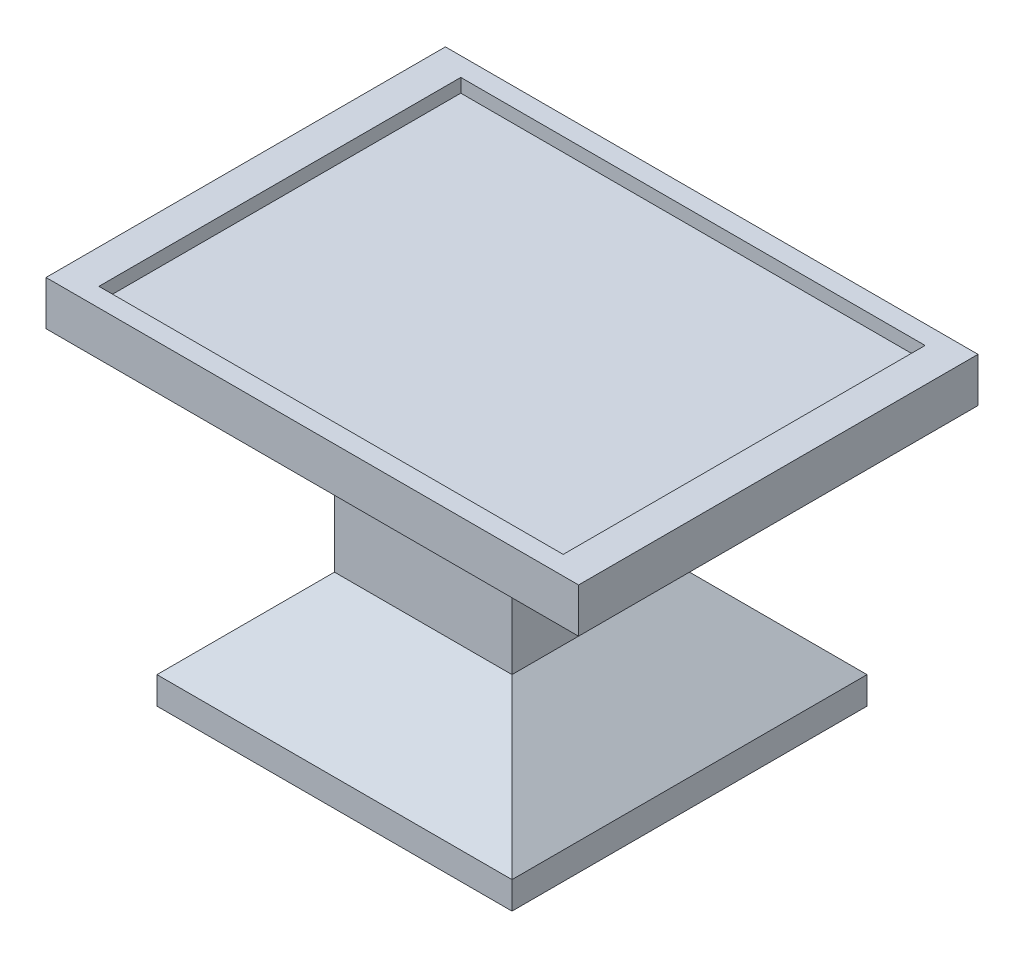
ISO-10303-21;
HEADER;
FILE_DESCRIPTION(('STEP AP214'),'2;1');
FILE_NAME('part.step','',(''),(''),'','','');
FILE_SCHEMA(('AUTOMOTIVE_DESIGN { 1 0 10303 214 1 1 1 1 }'));
ENDSEC;
DATA;
#1=APPLICATION_CONTEXT('core data for automotive mechanical design processes');
#2=APPLICATION_PROTOCOL_DEFINITION('international standard','automotive_design',2000,#1);
#3=PRODUCT_CONTEXT('',#1,'mechanical');
#4=PRODUCT('Part','Part','',(#3));
#5=PRODUCT_RELATED_PRODUCT_CATEGORY('part','',(#4));
#6=PRODUCT_DEFINITION_FORMATION('','',#4);
#7=PRODUCT_DEFINITION_CONTEXT('part definition',#1,'design');
#8=PRODUCT_DEFINITION('design','',#6,#7);
#9=PRODUCT_DEFINITION_SHAPE('','',#8);
#10=(LENGTH_UNIT() NAMED_UNIT(*) SI_UNIT(.MILLI.,.METRE.));
#11=(NAMED_UNIT(*) PLANE_ANGLE_UNIT() SI_UNIT($,.RADIAN.));
#12=(NAMED_UNIT(*) SI_UNIT($,.STERADIAN.) SOLID_ANGLE_UNIT());
#13=UNCERTAINTY_MEASURE_WITH_UNIT(LENGTH_MEASURE(1.E-05),#10,'distance_accuracy_value','');
#14=(GEOMETRIC_REPRESENTATION_CONTEXT(3) GLOBAL_UNCERTAINTY_ASSIGNED_CONTEXT((#13)) GLOBAL_UNIT_ASSIGNED_CONTEXT((#10,
#11,#12)) REPRESENTATION_CONTEXT('',''));
#15=CARTESIAN_POINT('',(0.,0.,0.));
#16=DIRECTION('',(0.,0.,1.));
#17=DIRECTION('',(1.,0.,0.));
#18=AXIS2_PLACEMENT_3D('',#15,#16,#17);
#19=CARTESIAN_POINT('',(0.,3.25,0.));
#20=DIRECTION('',(0.,1.,0.));
#21=DIRECTION('',(0.,0.,1.));
#22=AXIS2_PLACEMENT_3D('',#19,#20,#21);
#23=PLANE('',#22);
#24=DIRECTION('',(0.,0.,-1.));
#25=VECTOR('',#24,1.);
#26=CARTESIAN_POINT('',(19.5,3.25,-14.625));
#27=LINE('',#26,#25);
#28=CARTESIAN_POINT('',(19.5,3.25,14.625));
#29=VERTEX_POINT('',#28);
#30=CARTESIAN_POINT('',(19.5,3.25,-14.625));
#31=VERTEX_POINT('',#30);
#32=EDGE_CURVE('E378',#29,#31,#27,.T.);
#33=ORIENTED_EDGE('',*,*,#32,.T.);
#34=DIRECTION('',(-1.,0.,0.));
#35=VECTOR('',#34,1.);
#36=CARTESIAN_POINT('',(-19.5,3.25,-14.625));
#37=LINE('',#36,#35);
#38=CARTESIAN_POINT('',(-19.5,3.25,-14.625));
#39=VERTEX_POINT('',#38);
#40=EDGE_CURVE('E381',#31,#39,#37,.T.);
#41=ORIENTED_EDGE('',*,*,#40,.T.);
#42=DIRECTION('',(0.,0.,1.));
#43=VECTOR('',#42,1.);
#44=CARTESIAN_POINT('',(-19.5,3.25,-14.625));
#45=LINE('',#44,#43);
#46=CARTESIAN_POINT('',(-19.5,3.25,14.625));
#47=VERTEX_POINT('',#46);
#48=EDGE_CURVE('E129',#39,#47,#45,.T.);
#49=ORIENTED_EDGE('',*,*,#48,.T.);
#50=DIRECTION('',(1.,0.,0.));
#51=VECTOR('',#50,1.);
#52=CARTESIAN_POINT('',(-19.5,3.25,14.625));
#53=LINE('',#52,#51);
#54=EDGE_CURVE('E124',#47,#29,#53,.T.);
#55=ORIENTED_EDGE('',*,*,#54,.T.);
#56=EDGE_LOOP('',(#33,#41,#49,#55));
#57=FACE_BOUND('',#56,.T.);
#58=DIRECTION('',(1.,0.,0.));
#59=VECTOR('',#58,1.);
#60=CARTESIAN_POINT('',(-17.,3.25,-13.25));
#61=LINE('',#60,#59);
#62=CARTESIAN_POINT('',(-17.,3.25,-13.25));
#63=VERTEX_POINT('',#62);
#64=CARTESIAN_POINT('',(17.,3.25,-13.25));
#65=VERTEX_POINT('',#64);
#66=EDGE_CURVE('E210',#63,#65,#61,.T.);
#67=ORIENTED_EDGE('',*,*,#66,.T.);
#68=DIRECTION('',(0.,0.,-1.));
#69=VECTOR('',#68,1.);
#70=CARTESIAN_POINT('',(17.,3.25,-12.));
#71=LINE('',#70,#69);
#72=CARTESIAN_POINT('',(17.,3.25,13.25));
#73=VERTEX_POINT('',#72);
#74=EDGE_CURVE('E213',#73,#65,#71,.T.);
#75=ORIENTED_EDGE('',*,*,#74,.F.);
#76=DIRECTION('',(1.,0.,0.));
#77=VECTOR('',#76,1.);
#78=CARTESIAN_POINT('',(-17.,3.25,13.25));
#79=LINE('',#78,#77);
#80=CARTESIAN_POINT('',(-17.,3.25,13.25));
#81=VERTEX_POINT('',#80);
#82=EDGE_CURVE('E217',#81,#73,#79,.T.);
#83=ORIENTED_EDGE('',*,*,#82,.F.);
#84=DIRECTION('',(0.,0.,1.));
#85=VECTOR('',#84,1.);
#86=CARTESIAN_POINT('',(-17.,3.25,-12.));
#87=LINE('',#86,#85);
#88=EDGE_CURVE('E198',#63,#81,#87,.T.);
#89=ORIENTED_EDGE('',*,*,#88,.F.);
#90=EDGE_LOOP('',(#67,#75,#83,#89));
#91=FACE_BOUND('',#90,.T.);
#92=ADVANCED_FACE('F54',(#57,#91),#23,.T.);
#93=CARTESIAN_POINT('',(0.,0.,0.));
#94=DIRECTION('',(0.,1.,0.));
#95=DIRECTION('',(0.,0.,1.));
#96=AXIS2_PLACEMENT_3D('',#93,#94,#95);
#97=PLANE('',#96);
#98=DIRECTION('',(0.,0.,-1.));
#99=VECTOR('',#98,1.);
#100=CARTESIAN_POINT('',(19.5,0.,-14.625));
#101=LINE('',#100,#99);
#102=CARTESIAN_POINT('',(19.5,0.,14.625));
#103=VERTEX_POINT('',#102);
#104=CARTESIAN_POINT('',(19.5,0.,-14.625));
#105=VERTEX_POINT('',#104);
#106=EDGE_CURVE('E390',#103,#105,#101,.T.);
#107=ORIENTED_EDGE('',*,*,#106,.F.);
#108=DIRECTION('',(1.,0.,0.));
#109=VECTOR('',#108,1.);
#110=CARTESIAN_POINT('',(-19.5,0.,14.625));
#111=LINE('',#110,#109);
#112=CARTESIAN_POINT('',(-19.5,0.,14.625));
#113=VERTEX_POINT('',#112);
#114=EDGE_CURVE('E382',#113,#103,#111,.T.);
#115=ORIENTED_EDGE('',*,*,#114,.F.);
#116=DIRECTION('',(0.,0.,1.));
#117=VECTOR('',#116,1.);
#118=CARTESIAN_POINT('',(-19.5,0.,-14.625));
#119=LINE('',#118,#117);
#120=CARTESIAN_POINT('',(-19.5,0.,-14.625));
#121=VERTEX_POINT('',#120);
#122=EDGE_CURVE('E397',#121,#113,#119,.T.);
#123=ORIENTED_EDGE('',*,*,#122,.F.);
#124=DIRECTION('',(-1.,0.,0.));
#125=VECTOR('',#124,1.);
#126=CARTESIAN_POINT('',(-19.5,0.,-14.625));
#127=LINE('',#126,#125);
#128=EDGE_CURVE('E102',#105,#121,#127,.T.);
#129=ORIENTED_EDGE('',*,*,#128,.F.);
#130=EDGE_LOOP('',(#107,#115,#123,#129));
#131=FACE_BOUND('',#130,.T.);
#132=DIRECTION('',(0.,0.,1.));
#133=VECTOR('',#132,1.);
#134=CARTESIAN_POINT('',(6.5,0.,6.5));
#135=LINE('',#134,#133);
#136=CARTESIAN_POINT('',(6.5,0.,-6.5));
#137=VERTEX_POINT('',#136);
#138=CARTESIAN_POINT('',(6.5,0.,6.5));
#139=VERTEX_POINT('',#138);
#140=EDGE_CURVE('E75',#137,#139,#135,.T.);
#141=ORIENTED_EDGE('',*,*,#140,.F.);
#142=DIRECTION('',(1.,0.,0.));
#143=VECTOR('',#142,1.);
#144=CARTESIAN_POINT('',(-6.5,0.,-6.5));
#145=LINE('',#144,#143);
#146=CARTESIAN_POINT('',(-6.5,0.,-6.5));
#147=VERTEX_POINT('',#146);
#148=EDGE_CURVE('E374',#147,#137,#145,.T.);
#149=ORIENTED_EDGE('',*,*,#148,.F.);
#150=DIRECTION('',(0.,0.,-1.));
#151=VECTOR('',#150,1.);
#152=CARTESIAN_POINT('',(-6.5,0.,6.5));
#153=LINE('',#152,#151);
#154=CARTESIAN_POINT('',(-6.5,0.,6.5));
#155=VERTEX_POINT('',#154);
#156=EDGE_CURVE('E370',#155,#147,#153,.T.);
#157=ORIENTED_EDGE('',*,*,#156,.F.);
#158=DIRECTION('',(-1.,0.,0.));
#159=VECTOR('',#158,1.);
#160=CARTESIAN_POINT('',(-6.5,0.,6.5));
#161=LINE('',#160,#159);
#162=EDGE_CURVE('E116',#139,#155,#161,.T.);
#163=ORIENTED_EDGE('',*,*,#162,.F.);
#164=EDGE_LOOP('',(#141,#149,#157,#163));
#165=FACE_BOUND('',#164,.T.);
#166=ADVANCED_FACE('F482',(#131,#165),#97,.F.);
#167=CARTESIAN_POINT('',(19.5,3.25,-14.625));
#168=DIRECTION('',(-1.,0.,0.));
#169=DIRECTION('',(0.,0.,1.));
#170=AXIS2_PLACEMENT_3D('',#167,#168,#169);
#171=PLANE('',#170);
#172=ORIENTED_EDGE('',*,*,#106,.T.);
#173=DIRECTION('',(0.,-1.,0.));
#174=VECTOR('',#173,1.);
#175=CARTESIAN_POINT('',(19.5,3.25,-14.625));
#176=LINE('',#175,#174);
#177=EDGE_CURVE('E12',#31,#105,#176,.T.);
#178=ORIENTED_EDGE('',*,*,#177,.F.);
#179=ORIENTED_EDGE('',*,*,#32,.F.);
#180=DIRECTION('',(0.,-1.,0.));
#181=VECTOR('',#180,1.);
#182=CARTESIAN_POINT('',(19.5,3.25,14.625));
#183=LINE('',#182,#181);
#184=EDGE_CURVE('E389',#29,#103,#183,.T.);
#185=ORIENTED_EDGE('',*,*,#184,.T.);
#186=EDGE_LOOP('',(#172,#178,#179,#185));
#187=FACE_BOUND('',#186,.T.);
#188=ADVANCED_FACE('F56',(#187),#171,.F.);
#189=CARTESIAN_POINT('',(-19.5,3.25,-14.625));
#190=DIRECTION('',(0.,0.,1.));
#191=DIRECTION('',(1.,0.,0.));
#192=AXIS2_PLACEMENT_3D('',#189,#190,#191);
#193=PLANE('',#192);
#194=ORIENTED_EDGE('',*,*,#128,.T.);
#195=DIRECTION('',(0.,-1.,0.));
#196=VECTOR('',#195,1.);
#197=CARTESIAN_POINT('',(-19.5,3.25,-14.625));
#198=LINE('',#197,#196);
#199=EDGE_CURVE('E66',#39,#121,#198,.T.);
#200=ORIENTED_EDGE('',*,*,#199,.F.);
#201=ORIENTED_EDGE('',*,*,#40,.F.);
#202=ORIENTED_EDGE('',*,*,#177,.T.);
#203=EDGE_LOOP('',(#194,#200,#201,#202));
#204=FACE_BOUND('',#203,.T.);
#205=ADVANCED_FACE('F500',(#204),#193,.F.);
#206=CARTESIAN_POINT('',(-19.5,3.25,-14.625));
#207=DIRECTION('',(1.,0.,0.));
#208=DIRECTION('',(0.,0.,-1.));
#209=AXIS2_PLACEMENT_3D('',#206,#207,#208);
#210=PLANE('',#209);
#211=ORIENTED_EDGE('',*,*,#122,.T.);
#212=DIRECTION('',(0.,-1.,0.));
#213=VECTOR('',#212,1.);
#214=CARTESIAN_POINT('',(-19.5,3.25,14.625));
#215=LINE('',#214,#213);
#216=EDGE_CURVE('E405',#47,#113,#215,.T.);
#217=ORIENTED_EDGE('',*,*,#216,.F.);
#218=ORIENTED_EDGE('',*,*,#48,.F.);
#219=ORIENTED_EDGE('',*,*,#199,.T.);
#220=EDGE_LOOP('',(#211,#217,#218,#219));
#221=FACE_BOUND('',#220,.T.);
#222=ADVANCED_FACE('F497',(#221),#210,.F.);
#223=CARTESIAN_POINT('',(-19.5,3.25,14.625));
#224=DIRECTION('',(0.,0.,-1.));
#225=DIRECTION('',(-1.,0.,0.));
#226=AXIS2_PLACEMENT_3D('',#223,#224,#225);
#227=PLANE('',#226);
#228=ORIENTED_EDGE('',*,*,#114,.T.);
#229=ORIENTED_EDGE('',*,*,#184,.F.);
#230=ORIENTED_EDGE('',*,*,#54,.F.);
#231=ORIENTED_EDGE('',*,*,#216,.T.);
#232=EDGE_LOOP('',(#228,#229,#230,#231));
#233=FACE_BOUND('',#232,.T.);
#234=ADVANCED_FACE('F494',(#233),#227,.F.);
#235=CARTESIAN_POINT('',(6.5,-13.,6.5));
#236=DIRECTION('',(-1.,0.,0.));
#237=DIRECTION('',(0.,0.,1.));
#238=AXIS2_PLACEMENT_3D('',#235,#236,#237);
#239=PLANE('',#238);
#240=ORIENTED_EDGE('',*,*,#140,.T.);
#241=DIRECTION('',(0.,1.,0.));
#242=VECTOR('',#241,1.);
#243=CARTESIAN_POINT('',(6.5,-13.,6.5));
#244=LINE('',#243,#242);
#245=CARTESIAN_POINT('',(6.5,-13.,6.5));
#246=VERTEX_POINT('',#245);
#247=EDGE_CURVE('E394',#246,#139,#244,.T.);
#248=ORIENTED_EDGE('',*,*,#247,.F.);
#249=DIRECTION('',(0.,0.,1.));
#250=VECTOR('',#249,1.);
#251=CARTESIAN_POINT('',(6.5,-13.,0.));
#252=LINE('',#251,#250);
#253=CARTESIAN_POINT('',(6.5,-13.,-6.5));
#254=VERTEX_POINT('',#253);
#255=EDGE_CURVE('E377',#254,#246,#252,.T.);
#256=ORIENTED_EDGE('',*,*,#255,.F.);
#257=DIRECTION('',(0.,1.,0.));
#258=VECTOR('',#257,1.);
#259=CARTESIAN_POINT('',(6.5,-13.,-6.5));
#260=LINE('',#259,#258);
#261=EDGE_CURVE('E93',#254,#137,#260,.T.);
#262=ORIENTED_EDGE('',*,*,#261,.T.);
#263=EDGE_LOOP('',(#240,#248,#256,#262));
#264=FACE_BOUND('',#263,.T.);
#265=ADVANCED_FACE('F491',(#264),#239,.F.);
#266=CARTESIAN_POINT('',(-6.5,-13.,6.5));
#267=DIRECTION('',(0.,0.,-1.));
#268=DIRECTION('',(-1.,0.,0.));
#269=AXIS2_PLACEMENT_3D('',#266,#267,#268);
#270=PLANE('',#269);
#271=ORIENTED_EDGE('',*,*,#162,.T.);
#272=DIRECTION('',(0.,1.,0.));
#273=VECTOR('',#272,1.);
#274=CARTESIAN_POINT('',(-6.5,-13.,6.5));
#275=LINE('',#274,#273);
#276=CARTESIAN_POINT('',(-6.5,-13.,6.5));
#277=VERTEX_POINT('',#276);
#278=EDGE_CURVE('E414',#277,#155,#275,.T.);
#279=ORIENTED_EDGE('',*,*,#278,.F.);
#280=DIRECTION('',(1.,0.,0.));
#281=VECTOR('',#280,1.);
#282=CARTESIAN_POINT('',(0.,-13.,6.5));
#283=LINE('',#282,#281);
#284=EDGE_CURVE('E425',#246,#277,#283,.F.);
#285=ORIENTED_EDGE('',*,*,#284,.F.);
#286=ORIENTED_EDGE('',*,*,#247,.T.);
#287=EDGE_LOOP('',(#271,#279,#285,#286));
#288=FACE_BOUND('',#287,.T.);
#289=ADVANCED_FACE('F545',(#288),#270,.F.);
#290=CARTESIAN_POINT('',(-6.5,-13.,6.5));
#291=DIRECTION('',(1.,0.,0.));
#292=DIRECTION('',(0.,0.,-1.));
#293=AXIS2_PLACEMENT_3D('',#290,#291,#292);
#294=PLANE('',#293);
#295=ORIENTED_EDGE('',*,*,#156,.T.);
#296=DIRECTION('',(0.,1.,0.));
#297=VECTOR('',#296,1.);
#298=CARTESIAN_POINT('',(-6.5,-13.,-6.5));
#299=LINE('',#298,#297);
#300=CARTESIAN_POINT('',(-6.5,-13.,-6.5));
#301=VERTEX_POINT('',#300);
#302=EDGE_CURVE('E417',#301,#147,#299,.T.);
#303=ORIENTED_EDGE('',*,*,#302,.F.);
#304=DIRECTION('',(0.,0.,1.));
#305=VECTOR('',#304,1.);
#306=CARTESIAN_POINT('',(-6.5,-13.,0.));
#307=LINE('',#306,#305);
#308=EDGE_CURVE('E429',#277,#301,#307,.F.);
#309=ORIENTED_EDGE('',*,*,#308,.F.);
#310=ORIENTED_EDGE('',*,*,#278,.T.);
#311=EDGE_LOOP('',(#295,#303,#309,#310));
#312=FACE_BOUND('',#311,.T.);
#313=ADVANCED_FACE('F554',(#312),#294,.F.);
#314=CARTESIAN_POINT('',(-6.5,-13.,-6.5));
#315=DIRECTION('',(0.,0.,1.));
#316=DIRECTION('',(1.,0.,0.));
#317=AXIS2_PLACEMENT_3D('',#314,#315,#316);
#318=PLANE('',#317);
#319=ORIENTED_EDGE('',*,*,#148,.T.);
#320=ORIENTED_EDGE('',*,*,#261,.F.);
#321=DIRECTION('',(1.,0.,0.));
#322=VECTOR('',#321,1.);
#323=CARTESIAN_POINT('',(0.,-13.,-6.5));
#324=LINE('',#323,#322);
#325=EDGE_CURVE('E418',#301,#254,#324,.T.);
#326=ORIENTED_EDGE('',*,*,#325,.F.);
#327=ORIENTED_EDGE('',*,*,#302,.T.);
#328=EDGE_LOOP('',(#319,#320,#326,#327));
#329=FACE_BOUND('',#328,.T.);
#330=ADVANCED_FACE('F279',(#329),#318,.F.);
#331=CARTESIAN_POINT('',(0.,-3.25,3.25));
#332=DIRECTION('',(0.,-0.707106781186547,0.707106781186548));
#333=DIRECTION('',(0.,-0.707106781186548,-0.707106781186547));
#334=AXIS2_PLACEMENT_3D('',#331,#332,#333);
#335=PLANE('',#334);
#336=DIRECTION('',(0.577350269189626,0.577350269189626,0.577350269189625));
#337=VECTOR('',#336,1.);
#338=CARTESIAN_POINT('',(-13.,-19.5,-13.));
#339=LINE('',#338,#337);
#340=CARTESIAN_POINT('',(-13.,-19.5,-13.));
#341=VERTEX_POINT('',#340);
#342=EDGE_CURVE('E266',#341,#301,#339,.T.);
#343=ORIENTED_EDGE('',*,*,#342,.T.);
#344=ORIENTED_EDGE('',*,*,#325,.T.);
#345=DIRECTION('',(-0.577350269189626,0.577350269189626,0.577350269189626));
#346=VECTOR('',#345,1.);
#347=CARTESIAN_POINT('',(13.,-19.5,-13.));
#348=LINE('',#347,#346);
#349=CARTESIAN_POINT('',(13.,-19.5,-13.));
#350=VERTEX_POINT('',#349);
#351=EDGE_CURVE('E711',#350,#254,#348,.T.);
#352=ORIENTED_EDGE('',*,*,#351,.F.);
#353=DIRECTION('',(1.,0.,0.));
#354=VECTOR('',#353,1.);
#355=CARTESIAN_POINT('',(13.,-19.5,-13.));
#356=LINE('',#355,#354);
#357=EDGE_CURVE('E260',#341,#350,#356,.T.);
#358=ORIENTED_EDGE('',*,*,#357,.F.);
#359=EDGE_LOOP('',(#343,#344,#352,#358));
#360=FACE_BOUND('',#359,.T.);
#361=ADVANCED_FACE('F268',(#360),#335,.F.);
#362=CARTESIAN_POINT('',(-3.25,-3.24999999999999,0.));
#363=DIRECTION('',(-0.707106781186548,-0.707106781186547,0.));
#364=DIRECTION('',(0.707106781186547,-0.707106781186548,0.));
#365=AXIS2_PLACEMENT_3D('',#362,#363,#364);
#366=PLANE('',#365);
#367=ORIENTED_EDGE('',*,*,#351,.T.);
#368=ORIENTED_EDGE('',*,*,#255,.T.);
#369=DIRECTION('',(-0.577350269189625,0.577350269189626,-0.577350269189626));
#370=VECTOR('',#369,1.);
#371=CARTESIAN_POINT('',(13.,-19.5,13.));
#372=LINE('',#371,#370);
#373=CARTESIAN_POINT('',(13.,-19.5,13.));
#374=VERTEX_POINT('',#373);
#375=EDGE_CURVE('E367',#374,#246,#372,.T.);
#376=ORIENTED_EDGE('',*,*,#375,.F.);
#377=DIRECTION('',(0.,0.,1.));
#378=VECTOR('',#377,1.);
#379=CARTESIAN_POINT('',(13.,-19.5,-13.));
#380=LINE('',#379,#378);
#381=EDGE_CURVE('E306',#350,#374,#380,.T.);
#382=ORIENTED_EDGE('',*,*,#381,.F.);
#383=EDGE_LOOP('',(#367,#368,#376,#382));
#384=FACE_BOUND('',#383,.T.);
#385=ADVANCED_FACE('F278',(#384),#366,.F.);
#386=CARTESIAN_POINT('',(3.25,-3.25000000000001,0.));
#387=DIRECTION('',(0.707106781186547,-0.707106781186548,0.));
#388=DIRECTION('',(0.707106781186548,0.707106781186547,0.));
#389=AXIS2_PLACEMENT_3D('',#386,#387,#388);
#390=PLANE('',#389);
#391=DIRECTION('',(0.577350269189626,0.577350269189626,-0.577350269189626));
#392=VECTOR('',#391,1.);
#393=CARTESIAN_POINT('',(-13.,-19.5,13.));
#394=LINE('',#393,#392);
#395=CARTESIAN_POINT('',(-13.,-19.5,13.));
#396=VERTEX_POINT('',#395);
#397=EDGE_CURVE('E707',#396,#277,#394,.T.);
#398=ORIENTED_EDGE('',*,*,#397,.T.);
#399=ORIENTED_EDGE('',*,*,#308,.T.);
#400=ORIENTED_EDGE('',*,*,#342,.F.);
#401=DIRECTION('',(0.,0.,-1.));
#402=VECTOR('',#401,1.);
#403=CARTESIAN_POINT('',(-13.,-19.5,-13.));
#404=LINE('',#403,#402);
#405=EDGE_CURVE('E58',#396,#341,#404,.T.);
#406=ORIENTED_EDGE('',*,*,#405,.F.);
#407=EDGE_LOOP('',(#398,#399,#400,#406));
#408=FACE_BOUND('',#407,.T.);
#409=ADVANCED_FACE('F284',(#408),#390,.F.);
#410=CARTESIAN_POINT('',(0.,-3.25,-3.25));
#411=DIRECTION('',(0.,-0.707106781186548,-0.707106781186547));
#412=DIRECTION('',(0.,0.707106781186547,-0.707106781186548));
#413=AXIS2_PLACEMENT_3D('',#410,#411,#412);
#414=PLANE('',#413);
#415=ORIENTED_EDGE('',*,*,#375,.T.);
#416=ORIENTED_EDGE('',*,*,#284,.T.);
#417=ORIENTED_EDGE('',*,*,#397,.F.);
#418=DIRECTION('',(-1.,0.,0.));
#419=VECTOR('',#418,1.);
#420=CARTESIAN_POINT('',(13.,-19.5,13.));
#421=LINE('',#420,#419);
#422=EDGE_CURVE('E352',#374,#396,#421,.T.);
#423=ORIENTED_EDGE('',*,*,#422,.F.);
#424=EDGE_LOOP('',(#415,#416,#417,#423));
#425=FACE_BOUND('',#424,.T.);
#426=ADVANCED_FACE('F592',(#425),#414,.F.);
#427=CARTESIAN_POINT('',(17.,2.25,-12.));
#428=DIRECTION('',(1.,0.,0.));
#429=DIRECTION('',(0.,0.,-1.));
#430=AXIS2_PLACEMENT_3D('',#427,#428,#429);
#431=PLANE('',#430);
#432=ORIENTED_EDGE('',*,*,#74,.T.);
#433=DIRECTION('',(0.,1.,0.));
#434=VECTOR('',#433,1.);
#435=CARTESIAN_POINT('',(17.,2.25,-13.25));
#436=LINE('',#435,#434);
#437=CARTESIAN_POINT('',(17.,2.25,-13.25));
#438=VERTEX_POINT('',#437);
#439=EDGE_CURVE('E205',#438,#65,#436,.T.);
#440=ORIENTED_EDGE('',*,*,#439,.F.);
#441=DIRECTION('',(0.,0.,-1.));
#442=VECTOR('',#441,1.);
#443=CARTESIAN_POINT('',(17.,2.25,-12.));
#444=LINE('',#443,#442);
#445=CARTESIAN_POINT('',(17.,2.25,13.25));
#446=VERTEX_POINT('',#445);
#447=EDGE_CURVE('E186',#446,#438,#444,.T.);
#448=ORIENTED_EDGE('',*,*,#447,.F.);
#449=DIRECTION('',(0.,1.,0.));
#450=VECTOR('',#449,1.);
#451=CARTESIAN_POINT('',(17.,2.25,13.25));
#452=LINE('',#451,#450);
#453=EDGE_CURVE('E227',#446,#73,#452,.T.);
#454=ORIENTED_EDGE('',*,*,#453,.T.);
#455=EDGE_LOOP('',(#432,#440,#448,#454));
#456=FACE_BOUND('',#455,.T.);
#457=ADVANCED_FACE('F212',(#456),#431,.F.);
#458=CARTESIAN_POINT('',(-17.,2.25,-12.));
#459=DIRECTION('',(-1.,0.,0.));
#460=DIRECTION('',(0.,0.,1.));
#461=AXIS2_PLACEMENT_3D('',#458,#459,#460);
#462=PLANE('',#461);
#463=ORIENTED_EDGE('',*,*,#88,.T.);
#464=DIRECTION('',(0.,1.,0.));
#465=VECTOR('',#464,1.);
#466=CARTESIAN_POINT('',(-17.,2.25,13.25));
#467=LINE('',#466,#465);
#468=CARTESIAN_POINT('',(-17.,2.25,13.25));
#469=VERTEX_POINT('',#468);
#470=EDGE_CURVE('E223',#469,#81,#467,.T.);
#471=ORIENTED_EDGE('',*,*,#470,.F.);
#472=DIRECTION('',(0.,0.,1.));
#473=VECTOR('',#472,1.);
#474=CARTESIAN_POINT('',(-17.,2.25,-12.));
#475=LINE('',#474,#473);
#476=CARTESIAN_POINT('',(-17.,2.25,-13.25));
#477=VERTEX_POINT('',#476);
#478=EDGE_CURVE('E197',#477,#469,#475,.T.);
#479=ORIENTED_EDGE('',*,*,#478,.F.);
#480=DIRECTION('',(0.,1.,0.));
#481=VECTOR('',#480,1.);
#482=CARTESIAN_POINT('',(-17.,2.25,-13.25));
#483=LINE('',#482,#481);
#484=EDGE_CURVE('E208',#477,#63,#483,.T.);
#485=ORIENTED_EDGE('',*,*,#484,.T.);
#486=EDGE_LOOP('',(#463,#471,#479,#485));
#487=FACE_BOUND('',#486,.T.);
#488=ADVANCED_FACE('F610',(#487),#462,.F.);
#489=CARTESIAN_POINT('',(0.,2.25,0.));
#490=DIRECTION('',(0.,1.,0.));
#491=DIRECTION('',(0.,0.,1.));
#492=AXIS2_PLACEMENT_3D('',#489,#490,#491);
#493=PLANE('',#492);
#494=ORIENTED_EDGE('',*,*,#447,.T.);
#495=DIRECTION('',(1.,0.,0.));
#496=VECTOR('',#495,1.);
#497=CARTESIAN_POINT('',(-17.,2.25,-13.25));
#498=LINE('',#497,#496);
#499=EDGE_CURVE('E189',#477,#438,#498,.T.);
#500=ORIENTED_EDGE('',*,*,#499,.F.);
#501=ORIENTED_EDGE('',*,*,#478,.T.);
#502=DIRECTION('',(1.,0.,0.));
#503=VECTOR('',#502,1.);
#504=CARTESIAN_POINT('',(-17.,2.25,13.25));
#505=LINE('',#504,#503);
#506=EDGE_CURVE('E191',#469,#446,#505,.T.);
#507=ORIENTED_EDGE('',*,*,#506,.T.);
#508=EDGE_LOOP('',(#494,#500,#501,#507));
#509=FACE_BOUND('',#508,.T.);
#510=ADVANCED_FACE('F188',(#509),#493,.T.);
#511=CARTESIAN_POINT('',(13.,-21.5,13.));
#512=DIRECTION('',(-1.,0.,0.));
#513=DIRECTION('',(0.,0.,1.));
#514=AXIS2_PLACEMENT_3D('',#511,#512,#513);
#515=PLANE('',#514);
#516=ORIENTED_EDGE('',*,*,#381,.T.);
#517=DIRECTION('',(0.,1.,0.));
#518=VECTOR('',#517,1.);
#519=CARTESIAN_POINT('',(13.,-21.5,13.));
#520=LINE('',#519,#518);
#521=CARTESIAN_POINT('',(13.,-21.5,13.));
#522=VERTEX_POINT('',#521);
#523=EDGE_CURVE('E251',#522,#374,#520,.T.);
#524=ORIENTED_EDGE('',*,*,#523,.F.);
#525=DIRECTION('',(0.,0.,1.));
#526=VECTOR('',#525,1.);
#527=CARTESIAN_POINT('',(13.,-21.5,13.));
#528=LINE('',#527,#526);
#529=CARTESIAN_POINT('',(13.,-21.5,-13.));
#530=VERTEX_POINT('',#529);
#531=EDGE_CURVE('E230',#530,#522,#528,.T.);
#532=ORIENTED_EDGE('',*,*,#531,.F.);
#533=DIRECTION('',(0.,1.,0.));
#534=VECTOR('',#533,1.);
#535=CARTESIAN_POINT('',(13.,-21.5,-13.));
#536=LINE('',#535,#534);
#537=EDGE_CURVE('E245',#530,#350,#536,.T.);
#538=ORIENTED_EDGE('',*,*,#537,.T.);
#539=EDGE_LOOP('',(#516,#524,#532,#538));
#540=FACE_BOUND('',#539,.T.);
#541=ADVANCED_FACE('F341',(#540),#515,.F.);
#542=CARTESIAN_POINT('',(-13.,-21.5,13.));
#543=DIRECTION('',(0.,0.,-1.));
#544=DIRECTION('',(-1.,0.,0.));
#545=AXIS2_PLACEMENT_3D('',#542,#543,#544);
#546=PLANE('',#545);
#547=ORIENTED_EDGE('',*,*,#422,.T.);
#548=DIRECTION('',(0.,1.,0.));
#549=VECTOR('',#548,1.);
#550=CARTESIAN_POINT('',(-13.,-21.5,13.));
#551=LINE('',#550,#549);
#552=CARTESIAN_POINT('',(-13.,-21.5,13.));
#553=VERTEX_POINT('',#552);
#554=EDGE_CURVE('E315',#553,#396,#551,.T.);
#555=ORIENTED_EDGE('',*,*,#554,.F.);
#556=DIRECTION('',(-1.,0.,0.));
#557=VECTOR('',#556,1.);
#558=CARTESIAN_POINT('',(-13.,-21.5,13.));
#559=LINE('',#558,#557);
#560=EDGE_CURVE('E237',#522,#553,#559,.T.);
#561=ORIENTED_EDGE('',*,*,#560,.F.);
#562=ORIENTED_EDGE('',*,*,#523,.T.);
#563=EDGE_LOOP('',(#547,#555,#561,#562));
#564=FACE_BOUND('',#563,.T.);
#565=ADVANCED_FACE('F335',(#564),#546,.F.);
#566=CARTESIAN_POINT('',(-13.,-21.5,13.));
#567=DIRECTION('',(1.,0.,0.));
#568=DIRECTION('',(0.,0.,-1.));
#569=AXIS2_PLACEMENT_3D('',#566,#567,#568);
#570=PLANE('',#569);
#571=ORIENTED_EDGE('',*,*,#405,.T.);
#572=DIRECTION('',(0.,1.,0.));
#573=VECTOR('',#572,1.);
#574=CARTESIAN_POINT('',(-13.,-21.5,-13.));
#575=LINE('',#574,#573);
#576=CARTESIAN_POINT('',(-13.,-21.5,-13.));
#577=VERTEX_POINT('',#576);
#578=EDGE_CURVE('E311',#577,#341,#575,.T.);
#579=ORIENTED_EDGE('',*,*,#578,.F.);
#580=DIRECTION('',(0.,0.,-1.));
#581=VECTOR('',#580,1.);
#582=CARTESIAN_POINT('',(-13.,-21.5,13.));
#583=LINE('',#582,#581);
#584=EDGE_CURVE('E240',#553,#577,#583,.T.);
#585=ORIENTED_EDGE('',*,*,#584,.F.);
#586=ORIENTED_EDGE('',*,*,#554,.T.);
#587=EDGE_LOOP('',(#571,#579,#585,#586));
#588=FACE_BOUND('',#587,.T.);
#589=ADVANCED_FACE('F325',(#588),#570,.F.);
#590=CARTESIAN_POINT('',(-13.,-21.5,-13.));
#591=DIRECTION('',(0.,0.,1.));
#592=DIRECTION('',(1.,0.,0.));
#593=AXIS2_PLACEMENT_3D('',#590,#591,#592);
#594=PLANE('',#593);
#595=ORIENTED_EDGE('',*,*,#357,.T.);
#596=ORIENTED_EDGE('',*,*,#537,.F.);
#597=DIRECTION('',(1.,0.,0.));
#598=VECTOR('',#597,1.);
#599=CARTESIAN_POINT('',(-13.,-21.5,-13.));
#600=LINE('',#599,#598);
#601=EDGE_CURVE('E243',#577,#530,#600,.T.);
#602=ORIENTED_EDGE('',*,*,#601,.F.);
#603=ORIENTED_EDGE('',*,*,#578,.T.);
#604=EDGE_LOOP('',(#595,#596,#602,#603));
#605=FACE_BOUND('',#604,.T.);
#606=ADVANCED_FACE('F334',(#605),#594,.F.);
#607=CARTESIAN_POINT('',(0.,-21.5,0.));
#608=DIRECTION('',(0.,-1.,0.));
#609=DIRECTION('',(0.,0.,-1.));
#610=AXIS2_PLACEMENT_3D('',#607,#608,#609);
#611=PLANE('',#610);
#612=ORIENTED_EDGE('',*,*,#531,.T.);
#613=ORIENTED_EDGE('',*,*,#560,.T.);
#614=ORIENTED_EDGE('',*,*,#584,.T.);
#615=ORIENTED_EDGE('',*,*,#601,.T.);
#616=EDGE_LOOP('',(#612,#613,#614,#615));
#617=FACE_BOUND('',#616,.T.);
#618=ADVANCED_FACE('F472',(#617),#611,.T.);
#619=CARTESIAN_POINT('',(-17.,2.25,13.25));
#620=DIRECTION('',(0.,0.,1.));
#621=DIRECTION('',(1.,0.,0.));
#622=AXIS2_PLACEMENT_3D('',#619,#620,#621);
#623=PLANE('',#622);
#624=ORIENTED_EDGE('',*,*,#82,.T.);
#625=ORIENTED_EDGE('',*,*,#453,.F.);
#626=ORIENTED_EDGE('',*,*,#506,.F.);
#627=ORIENTED_EDGE('',*,*,#470,.T.);
#628=EDGE_LOOP('',(#624,#625,#626,#627));
#629=FACE_BOUND('',#628,.T.);
#630=ADVANCED_FACE('F474',(#629),#623,.F.);
#631=CARTESIAN_POINT('',(-17.,2.25,-13.25));
#632=DIRECTION('',(0.,0.,1.));
#633=DIRECTION('',(1.,0.,0.));
#634=AXIS2_PLACEMENT_3D('',#631,#632,#633);
#635=PLANE('',#634);
#636=ORIENTED_EDGE('',*,*,#66,.F.);
#637=ORIENTED_EDGE('',*,*,#484,.F.);
#638=ORIENTED_EDGE('',*,*,#499,.T.);
#639=ORIENTED_EDGE('',*,*,#439,.T.);
#640=EDGE_LOOP('',(#636,#637,#638,#639));
#641=FACE_BOUND('',#640,.T.);
#642=ADVANCED_FACE('F204',(#641),#635,.T.);
#643=CLOSED_SHELL('',(#92,#166,#188,#205,#222,#234,#265,#289,#313,#330,#361,#385,#409,#426,#457,
#488,#510,#541,#565,#589,#606,#618,#630,#642));
#644=MANIFOLD_SOLID_BREP('B2',#643);
#645=ADVANCED_BREP_SHAPE_REPRESENTATION('',(#18,#644),#14);
#646=SHAPE_DEFINITION_REPRESENTATION(#9,#645);
ENDSEC;
END-ISO-10303-21;
